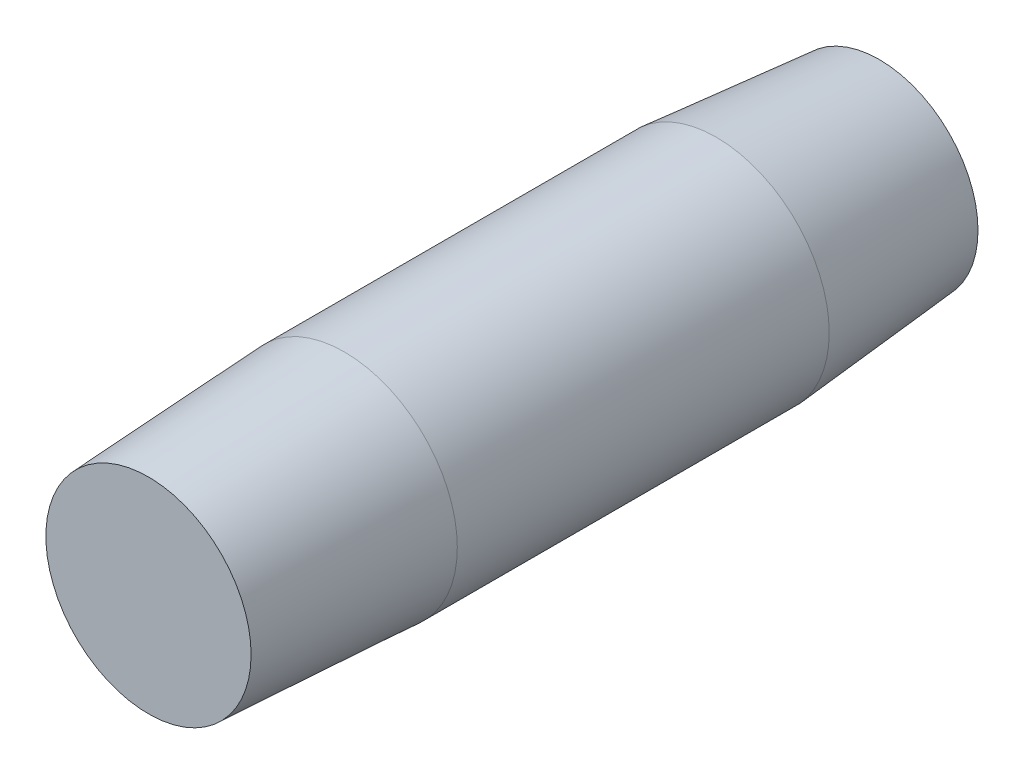
ISO-10303-21;
HEADER;
FILE_DESCRIPTION(('STEP AP214'),'2;1');
FILE_NAME('part.step','',(''),(''),'','','');
FILE_SCHEMA(('AUTOMOTIVE_DESIGN { 1 0 10303 214 1 1 1 1 }'));
ENDSEC;
DATA;
#1=APPLICATION_CONTEXT('core data for automotive mechanical design processes');
#2=APPLICATION_PROTOCOL_DEFINITION('international standard','automotive_design',2000,#1);
#3=PRODUCT_CONTEXT('',#1,'mechanical');
#4=PRODUCT('Part','Part','',(#3));
#5=PRODUCT_RELATED_PRODUCT_CATEGORY('part','',(#4));
#6=PRODUCT_DEFINITION_FORMATION('','',#4);
#7=PRODUCT_DEFINITION_CONTEXT('part definition',#1,'design');
#8=PRODUCT_DEFINITION('design','',#6,#7);
#9=PRODUCT_DEFINITION_SHAPE('','',#8);
#10=(LENGTH_UNIT() NAMED_UNIT(*) SI_UNIT(.MILLI.,.METRE.));
#11=(NAMED_UNIT(*) PLANE_ANGLE_UNIT() SI_UNIT($,.RADIAN.));
#12=(NAMED_UNIT(*) SI_UNIT($,.STERADIAN.) SOLID_ANGLE_UNIT());
#13=UNCERTAINTY_MEASURE_WITH_UNIT(LENGTH_MEASURE(1.E-05),#10,'distance_accuracy_value','');
#14=(GEOMETRIC_REPRESENTATION_CONTEXT(3) GLOBAL_UNCERTAINTY_ASSIGNED_CONTEXT((#13)) GLOBAL_UNIT_ASSIGNED_CONTEXT((#10,
#11,#12)) REPRESENTATION_CONTEXT('',''));
#15=CARTESIAN_POINT('',(0.,0.,0.));
#16=DIRECTION('',(0.,0.,1.));
#17=DIRECTION('',(1.,0.,0.));
#18=AXIS2_PLACEMENT_3D('',#15,#16,#17);
#19=CARTESIAN_POINT('',(0.,0.,-28.0212608028108));
#20=DIRECTION('',(0.,0.,-1.));
#21=DIRECTION('',(-1.,0.,0.));
#22=AXIS2_PLACEMENT_3D('',#19,#20,#21);
#23=PLANE('',#22);
#24=CARTESIAN_POINT('',(0.,0.,-28.0212608028108));
#25=DIRECTION('',(0.,0.,-1.));
#26=DIRECTION('',(-1.,0.,0.));
#27=AXIS2_PLACEMENT_3D('',#24,#25,#26);
#28=CIRCLE('',#27,14.9995171770484);
#29=CARTESIAN_POINT('',(-14.9995171770484,0.,-28.0212608028108));
#30=VERTEX_POINT('',#29);
#31=EDGE_CURVE('E42',#30,#30,#28,.T.);
#32=ORIENTED_EDGE('',*,*,#31,.T.);
#33=EDGE_LOOP('',(#32));
#34=FACE_BOUND('',#33,.T.);
#35=ADVANCED_FACE('F38',(#34),#23,.T.);
#36=CARTESIAN_POINT('',(0.,0.,-3.20382965426124));
#37=DIRECTION('',(0.,0.,1.));
#38=DIRECTION('',(-1.,0.,0.));
#39=AXIS2_PLACEMENT_3D('',#36,#37,#38);
#40=CONICAL_SURFACE('',#39,17.1707610603817,0.0872664625997166);
#41=ORIENTED_EDGE('',*,*,#31,.F.);
#42=EDGE_LOOP('',(#41));
#43=FACE_BOUND('',#42,.T.);
#44=CARTESIAN_POINT('',(0.,0.,-3.22126080281077));
#45=DIRECTION('',(0.,0.,-1.));
#46=DIRECTION('',(-1.,0.,0.));
#47=AXIS2_PLACEMENT_3D('',#44,#45,#46);
#48=CIRCLE('',#47,17.1692360324913);
#49=CARTESIAN_POINT('',(-17.1692360324913,0.,-3.22126080281077));
#50=VERTEX_POINT('',#49);
#51=EDGE_CURVE('E56',#50,#50,#48,.T.);
#52=ORIENTED_EDGE('',*,*,#51,.T.);
#53=EDGE_LOOP('',(#52));
#54=FACE_BOUND('',#53,.T.);
#55=ADVANCED_FACE('F40',(#43,#54),#40,.T.);
#56=CARTESIAN_POINT('',(0.,0.,-3.22126080281077));
#57=DIRECTION('',(0.,0.,-1.));
#58=DIRECTION('',(-1.,0.,0.));
#59=AXIS2_PLACEMENT_3D('',#56,#57,#58);
#60=PLANE('',#59);
#61=ORIENTED_EDGE('',*,*,#51,.F.);
#62=EDGE_LOOP('',(#61));
#63=FACE_BOUND('',#62,.T.);
#64=CARTESIAN_POINT('',(0.,0.,-3.22126080281077));
#65=DIRECTION('',(0.,0.,1.));
#66=DIRECTION('',(1.,0.,0.));
#67=AXIS2_PLACEMENT_3D('',#64,#65,#66);
#68=CIRCLE('',#67,17.17);
#69=CARTESIAN_POINT('',(17.17,0.,-3.22126080281077));
#70=VERTEX_POINT('',#69);
#71=EDGE_CURVE('E51',#70,#70,#68,.T.);
#72=ORIENTED_EDGE('',*,*,#71,.F.);
#73=EDGE_LOOP('',(#72));
#74=FACE_BOUND('',#73,.T.);
#75=ADVANCED_FACE('F75',(#63,#74),#60,.T.);
#76=CARTESIAN_POINT('',(0.,0.,20.0087391971892));
#77=DIRECTION('',(0.,0.,-1.));
#78=DIRECTION('',(-1.,0.,0.));
#79=AXIS2_PLACEMENT_3D('',#76,#77,#78);
#80=CYLINDRICAL_SURFACE('',#79,17.17);
#81=ORIENTED_EDGE('',*,*,#71,.T.);
#82=EDGE_LOOP('',(#81));
#83=FACE_BOUND('',#82,.T.);
#84=CARTESIAN_POINT('',(0.,0.,53.3387391971892));
#85=DIRECTION('',(0.,0.,1.));
#86=DIRECTION('',(1.,0.,0.));
#87=AXIS2_PLACEMENT_3D('',#84,#85,#86);
#88=CIRCLE('',#87,17.1697255308004);
#89=CARTESIAN_POINT('',(17.1697255308004,0.,53.3387391971892));
#90=VERTEX_POINT('',#89);
#91=EDGE_CURVE('E11',#90,#90,#88,.T.);
#92=ORIENTED_EDGE('',*,*,#91,.F.);
#93=EDGE_LOOP('',(#92));
#94=FACE_BOUND('',#93,.T.);
#95=ADVANCED_FACE('F64',(#83,#94),#80,.T.);
#96=CARTESIAN_POINT('',(0.,0.,83.1387391971892));
#97=DIRECTION('',(0.,0.,1.));
#98=DIRECTION('',(1.,0.,0.));
#99=AXIS2_PLACEMENT_3D('',#96,#97,#98);
#100=PLANE('',#99);
#101=CARTESIAN_POINT('',(0.,0.,83.1387391971892));
#102=DIRECTION('',(0.,0.,1.));
#103=DIRECTION('',(1.,0.,0.));
#104=AXIS2_PLACEMENT_3D('',#101,#102,#103);
#105=CIRCLE('',#104,15.6079737081658);
#106=CARTESIAN_POINT('',(15.6079737081658,0.,83.1387391971892));
#107=VERTEX_POINT('',#106);
#108=EDGE_CURVE('E46',#107,#107,#105,.T.);
#109=ORIENTED_EDGE('',*,*,#108,.T.);
#110=EDGE_LOOP('',(#109));
#111=FACE_BOUND('',#110,.T.);
#112=ADVANCED_FACE('F74',(#111),#100,.T.);
#113=CARTESIAN_POINT('',(0.,0.,53.3282720059407));
#114=DIRECTION('',(0.,0.,-1.));
#115=DIRECTION('',(1.,0.,0.));
#116=AXIS2_PLACEMENT_3D('',#113,#114,#115);
#117=CONICAL_SURFACE('',#116,17.1702740930491,0.05235987755983);
#118=ORIENTED_EDGE('',*,*,#108,.F.);
#119=EDGE_LOOP('',(#118));
#120=FACE_BOUND('',#119,.T.);
#121=ORIENTED_EDGE('',*,*,#91,.T.);
#122=EDGE_LOOP('',(#121));
#123=FACE_BOUND('',#122,.T.);
#124=ADVANCED_FACE('F77',(#120,#123),#117,.T.);
#125=CLOSED_SHELL('',(#35,#55,#75,#95,#112,#124));
#126=MANIFOLD_SOLID_BREP('B2',#125);
#127=ADVANCED_BREP_SHAPE_REPRESENTATION('',(#18,#126),#14);
#128=SHAPE_DEFINITION_REPRESENTATION(#9,#127);
ENDSEC;
END-ISO-10303-21;
